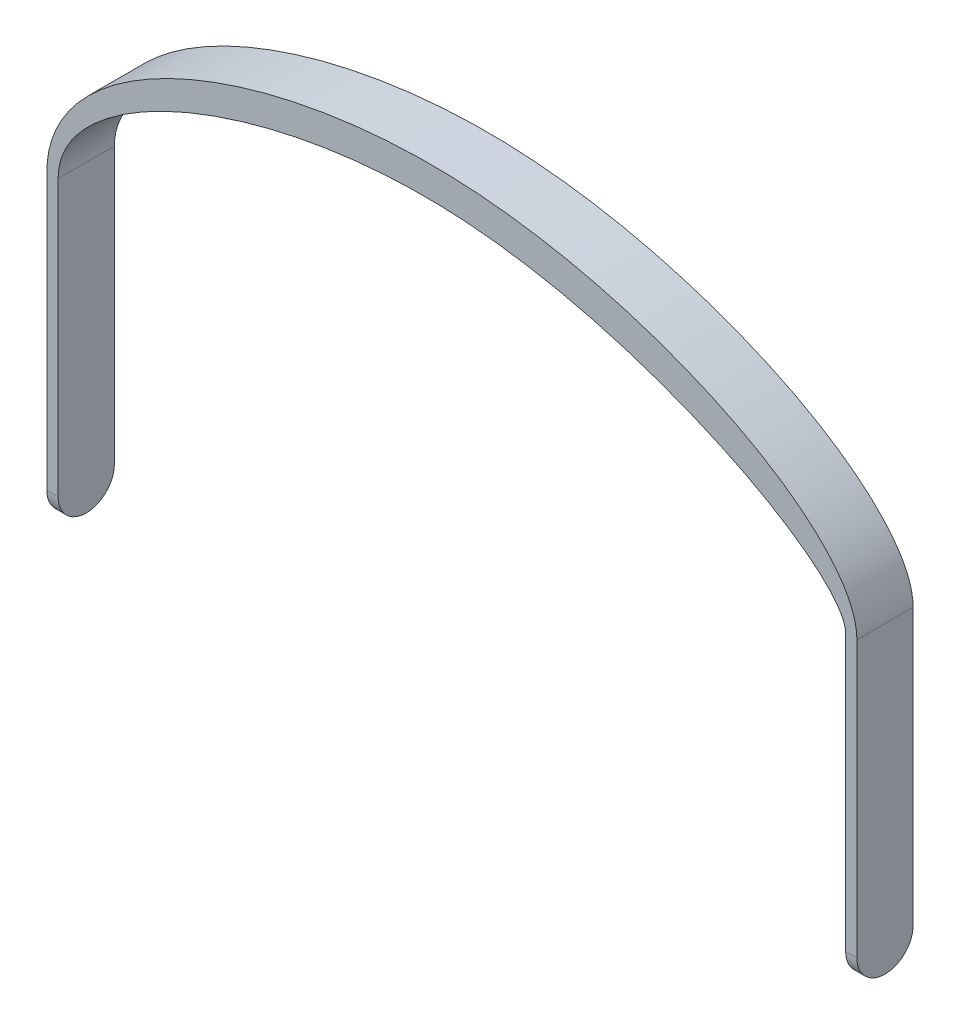
ISO-10303-21;
HEADER;
FILE_DESCRIPTION(('STEP AP214'),'2;1');
FILE_NAME('part.step','',(''),(''),'','','');
FILE_SCHEMA(('AUTOMOTIVE_DESIGN { 1 0 10303 214 1 1 1 1 }'));
ENDSEC;
DATA;
#1=APPLICATION_CONTEXT('core data for automotive mechanical design processes');
#2=APPLICATION_PROTOCOL_DEFINITION('international standard','automotive_design',2000,#1);
#3=PRODUCT_CONTEXT('',#1,'mechanical');
#4=PRODUCT('Part','Part','',(#3));
#5=PRODUCT_RELATED_PRODUCT_CATEGORY('part','',(#4));
#6=PRODUCT_DEFINITION_FORMATION('','',#4);
#7=PRODUCT_DEFINITION_CONTEXT('part definition',#1,'design');
#8=PRODUCT_DEFINITION('design','',#6,#7);
#9=PRODUCT_DEFINITION_SHAPE('','',#8);
#10=(LENGTH_UNIT() NAMED_UNIT(*) SI_UNIT(.MILLI.,.METRE.));
#11=(NAMED_UNIT(*) PLANE_ANGLE_UNIT() SI_UNIT($,.RADIAN.));
#12=(NAMED_UNIT(*) SI_UNIT($,.STERADIAN.) SOLID_ANGLE_UNIT());
#13=UNCERTAINTY_MEASURE_WITH_UNIT(LENGTH_MEASURE(1.E-05),#10,'distance_accuracy_value','');
#14=(GEOMETRIC_REPRESENTATION_CONTEXT(3) GLOBAL_UNCERTAINTY_ASSIGNED_CONTEXT((#13)) GLOBAL_UNIT_ASSIGNED_CONTEXT((#10,
#11,#12)) REPRESENTATION_CONTEXT('',''));
#15=CARTESIAN_POINT('',(0.,0.,0.));
#16=DIRECTION('',(0.,0.,1.));
#17=DIRECTION('',(1.,0.,0.));
#18=AXIS2_PLACEMENT_3D('',#15,#16,#17);
#19=CARTESIAN_POINT('',(182.88,-129.54,25.4));
#20=DIRECTION('',(-1.,0.,0.));
#21=DIRECTION('',(0.,0.,1.));
#22=AXIS2_PLACEMENT_3D('',#19,#20,#21);
#23=PLANE('',#22);
#24=CARTESIAN_POINT('',(182.88,-116.84,12.7));
#25=DIRECTION('',(-1.,0.,0.));
#26=DIRECTION('',(0.,0.,1.));
#27=AXIS2_PLACEMENT_3D('',#24,#25,#26);
#28=CIRCLE('',#27,12.7);
#29=CARTESIAN_POINT('',(182.88,-116.84,25.4));
#30=VERTEX_POINT('',#29);
#31=CARTESIAN_POINT('',(182.88,-129.54,12.7));
#32=VERTEX_POINT('',#31);
#33=EDGE_CURVE('E206',#30,#32,#28,.F.);
#34=ORIENTED_EDGE('',*,*,#33,.T.);
#35=CARTESIAN_POINT('',(182.88,-116.84,12.7));
#36=DIRECTION('',(-1.,0.,0.));
#37=DIRECTION('',(0.,0.,1.));
#38=AXIS2_PLACEMENT_3D('',#35,#36,#37);
#39=CIRCLE('',#38,12.7);
#40=CARTESIAN_POINT('',(182.88,-116.84,0.));
#41=VERTEX_POINT('',#40);
#42=EDGE_CURVE('E175',#32,#41,#39,.F.);
#43=ORIENTED_EDGE('',*,*,#42,.T.);
#44=DIRECTION('',(0.,1.,0.));
#45=VECTOR('',#44,1.);
#46=CARTESIAN_POINT('',(182.88,-129.54,0.));
#47=LINE('',#46,#45);
#48=CARTESIAN_POINT('',(182.88,7.57860607966033,0.));
#49=VERTEX_POINT('',#48);
#50=EDGE_CURVE('E122',#41,#49,#47,.T.);
#51=ORIENTED_EDGE('',*,*,#50,.T.);
#52=DIRECTION('',(0.,0.,-1.));
#53=VECTOR('',#52,1.);
#54=CARTESIAN_POINT('',(182.88,7.57860607966033,25.4));
#55=LINE('',#54,#53);
#56=CARTESIAN_POINT('',(182.88,7.57860607966033,25.4));
#57=VERTEX_POINT('',#56);
#58=EDGE_CURVE('E120',#57,#49,#55,.T.);
#59=ORIENTED_EDGE('',*,*,#58,.F.);
#60=DIRECTION('',(0.,1.,0.));
#61=VECTOR('',#60,1.);
#62=CARTESIAN_POINT('',(182.88,-129.54,25.4));
#63=LINE('',#62,#61);
#64=EDGE_CURVE('E107',#30,#57,#63,.T.);
#65=ORIENTED_EDGE('',*,*,#64,.F.);
#66=EDGE_LOOP('',(#34,#43,#51,#59,#65));
#67=FACE_BOUND('',#66,.T.);
#68=ADVANCED_FACE('F32',(#67),#23,.F.);
#69=CARTESIAN_POINT('',(182.88,7.57860607966033,25.4));
#70=CARTESIAN_POINT('',(182.88,46.7638219621217,25.4));
#71=CARTESIAN_POINT('',(-5.51913115903746E-13,141.3944737078,25.4));
#72=CARTESIAN_POINT('',(-182.88,58.9080605602155,25.4));
#73=CARTESIAN_POINT('',(-182.88,7.57860607966011,25.4));
#74=B_SPLINE_CURVE_WITH_KNOTS('',3,(#69,#70,#71,#72,#73),.UNSPECIFIED.,.F.,.F.,(4,1,4),(0.,
0.499999999999999,1.),.UNSPECIFIED.);
#75=DIRECTION('',(0.,0.,-1.));
#76=VECTOR('',#75,1.);
#77=SURFACE_OF_LINEAR_EXTRUSION('',#74,#76);
#78=CARTESIAN_POINT('',(182.88,7.57860607966033,0.));
#79=CARTESIAN_POINT('',(182.88,46.7638219621217,0.));
#80=CARTESIAN_POINT('',(-5.51913115903746E-13,141.3944737078,0.));
#81=CARTESIAN_POINT('',(-182.88,58.9080605602155,0.));
#82=CARTESIAN_POINT('',(-182.88,7.57860607966011,0.));
#83=B_SPLINE_CURVE_WITH_KNOTS('',3,(#78,#79,#80,#81,#82),.UNSPECIFIED.,.F.,.F.,(4,1,4),(0.,
0.499999999999999,1.),.UNSPECIFIED.);
#84=CARTESIAN_POINT('',(-182.88,7.57860607966011,0.));
#85=VERTEX_POINT('',#84);
#86=EDGE_CURVE('E214',#49,#85,#83,.T.);
#87=ORIENTED_EDGE('',*,*,#86,.T.);
#88=DIRECTION('',(0.,0.,-1.));
#89=VECTOR('',#88,1.);
#90=CARTESIAN_POINT('',(-182.88,7.57860607966011,25.4));
#91=LINE('',#90,#89);
#92=CARTESIAN_POINT('',(-182.88,7.57860607966011,25.4));
#93=VERTEX_POINT('',#92);
#94=EDGE_CURVE('E127',#93,#85,#91,.T.);
#95=ORIENTED_EDGE('',*,*,#94,.F.);
#96=EDGE_CURVE('E112',#57,#93,#74,.T.);
#97=ORIENTED_EDGE('',*,*,#96,.F.);
#98=ORIENTED_EDGE('',*,*,#58,.T.);
#99=EDGE_LOOP('',(#87,#95,#97,#98));
#100=FACE_BOUND('',#99,.T.);
#101=ADVANCED_FACE('F129',(#100),#77,.F.);
#102=CARTESIAN_POINT('',(-182.88,-129.54,25.4));
#103=DIRECTION('',(-1.,0.,0.));
#104=DIRECTION('',(0.,-1.,0.));
#105=AXIS2_PLACEMENT_3D('',#102,#103,#104);
#106=PLANE('',#105);
#107=DIRECTION('',(0.,1.,0.));
#108=VECTOR('',#107,1.);
#109=CARTESIAN_POINT('',(-182.88,-129.54,0.));
#110=LINE('',#109,#108);
#111=CARTESIAN_POINT('',(-182.88,-116.84,0.));
#112=VERTEX_POINT('',#111);
#113=EDGE_CURVE('E216',#112,#85,#110,.T.);
#114=ORIENTED_EDGE('',*,*,#113,.F.);
#115=CARTESIAN_POINT('',(-182.88,-116.84,12.7));
#116=DIRECTION('',(-1.,0.,0.));
#117=DIRECTION('',(0.,-1.,0.));
#118=AXIS2_PLACEMENT_3D('',#115,#116,#117);
#119=CIRCLE('',#118,12.7);
#120=CARTESIAN_POINT('',(-182.88,-129.54,12.7));
#121=VERTEX_POINT('',#120);
#122=EDGE_CURVE('E198',#112,#121,#119,.T.);
#123=ORIENTED_EDGE('',*,*,#122,.T.);
#124=CARTESIAN_POINT('',(-182.88,-116.84,12.7));
#125=DIRECTION('',(-1.,0.,0.));
#126=DIRECTION('',(0.,-1.,0.));
#127=AXIS2_PLACEMENT_3D('',#124,#125,#126);
#128=CIRCLE('',#127,12.7);
#129=CARTESIAN_POINT('',(-182.88,-116.84,25.4));
#130=VERTEX_POINT('',#129);
#131=EDGE_CURVE('E196',#121,#130,#128,.T.);
#132=ORIENTED_EDGE('',*,*,#131,.T.);
#133=DIRECTION('',(0.,1.,0.));
#134=VECTOR('',#133,1.);
#135=CARTESIAN_POINT('',(-182.88,-129.54,25.4));
#136=LINE('',#135,#134);
#137=EDGE_CURVE('E131',#130,#93,#136,.T.);
#138=ORIENTED_EDGE('',*,*,#137,.T.);
#139=ORIENTED_EDGE('',*,*,#94,.T.);
#140=EDGE_LOOP('',(#114,#123,#132,#138,#139));
#141=FACE_BOUND('',#140,.T.);
#142=ADVANCED_FACE('F146',(#141),#106,.T.);
#143=CARTESIAN_POINT('',(-177.8,7.57860607966027,25.4));
#144=DIRECTION('',(1.,0.,0.));
#145=DIRECTION('',(0.,0.,-1.));
#146=AXIS2_PLACEMENT_3D('',#143,#144,#145);
#147=PLANE('',#146);
#148=CARTESIAN_POINT('',(-177.8,-116.84,12.7));
#149=DIRECTION('',(1.,0.,0.));
#150=DIRECTION('',(0.,0.,-1.));
#151=AXIS2_PLACEMENT_3D('',#148,#149,#150);
#152=CIRCLE('',#151,12.7);
#153=CARTESIAN_POINT('',(-177.8,-116.84,25.4));
#154=VERTEX_POINT('',#153);
#155=CARTESIAN_POINT('',(-177.8,-129.54,12.7));
#156=VERTEX_POINT('',#155);
#157=EDGE_CURVE('E200',#154,#156,#152,.T.);
#158=ORIENTED_EDGE('',*,*,#157,.T.);
#159=CARTESIAN_POINT('',(-177.8,-116.84,12.7));
#160=DIRECTION('',(1.,0.,0.));
#161=DIRECTION('',(0.,0.,-1.));
#162=AXIS2_PLACEMENT_3D('',#159,#160,#161);
#163=CIRCLE('',#162,12.7);
#164=CARTESIAN_POINT('',(-177.8,-116.84,0.));
#165=VERTEX_POINT('',#164);
#166=EDGE_CURVE('E202',#156,#165,#163,.T.);
#167=ORIENTED_EDGE('',*,*,#166,.T.);
#168=DIRECTION('',(0.,-1.,0.));
#169=VECTOR('',#168,1.);
#170=CARTESIAN_POINT('',(-177.8,7.57860607966027,0.));
#171=LINE('',#170,#169);
#172=CARTESIAN_POINT('',(-177.8,7.57860607966027,0.));
#173=VERTEX_POINT('',#172);
#174=EDGE_CURVE('E183',#173,#165,#171,.T.);
#175=ORIENTED_EDGE('',*,*,#174,.F.);
#176=DIRECTION('',(0.,0.,-1.));
#177=VECTOR('',#176,1.);
#178=CARTESIAN_POINT('',(-177.8,7.57860607966027,25.4));
#179=LINE('',#178,#177);
#180=CARTESIAN_POINT('',(-177.8,7.57860607966027,25.4));
#181=VERTEX_POINT('',#180);
#182=EDGE_CURVE('E190',#181,#173,#179,.T.);
#183=ORIENTED_EDGE('',*,*,#182,.F.);
#184=DIRECTION('',(0.,-1.,0.));
#185=VECTOR('',#184,1.);
#186=CARTESIAN_POINT('',(-177.8,7.57860607966027,25.4));
#187=LINE('',#186,#185);
#188=EDGE_CURVE('E133',#181,#154,#187,.T.);
#189=ORIENTED_EDGE('',*,*,#188,.T.);
#190=EDGE_LOOP('',(#158,#167,#175,#183,#189));
#191=FACE_BOUND('',#190,.T.);
#192=ADVANCED_FACE('F237',(#191),#147,.T.);
#193=CARTESIAN_POINT('',(-177.8,7.57860607966027,25.4));
#194=CARTESIAN_POINT('',(-177.8,46.3000782283205,25.4));
#195=CARTESIAN_POINT('',(1.48644117847763E-12,128.042210107522,25.4));
#196=CARTESIAN_POINT('',(177.8,30.0171278246351,25.4));
#197=CARTESIAN_POINT('',(177.8,7.57860607966014,25.4));
#198=B_SPLINE_CURVE_WITH_KNOTS('',3,(#193,#194,#195,#196,#197),.UNSPECIFIED.,.F.,.F.,(4,1,4),
(0.,0.499999999999998,1.),.UNSPECIFIED.);
#199=DIRECTION('',(0.,0.,-1.));
#200=VECTOR('',#199,1.);
#201=SURFACE_OF_LINEAR_EXTRUSION('',#198,#200);
#202=CARTESIAN_POINT('',(-177.8,7.57860607966027,0.));
#203=CARTESIAN_POINT('',(-177.8,46.3000782283205,0.));
#204=CARTESIAN_POINT('',(1.48644117847763E-12,128.042210107522,0.));
#205=CARTESIAN_POINT('',(177.8,30.0171278246351,0.));
#206=CARTESIAN_POINT('',(177.8,7.57860607966014,0.));
#207=B_SPLINE_CURVE_WITH_KNOTS('',3,(#202,#203,#204,#205,#206),.UNSPECIFIED.,.F.,.F.,(4,1,4),
(0.,0.499999999999998,1.),.UNSPECIFIED.);
#208=CARTESIAN_POINT('',(177.8,7.57860607966014,0.));
#209=VERTEX_POINT('',#208);
#210=EDGE_CURVE('E181',#173,#209,#207,.T.);
#211=ORIENTED_EDGE('',*,*,#210,.T.);
#212=DIRECTION('',(0.,0.,-1.));
#213=VECTOR('',#212,1.);
#214=CARTESIAN_POINT('',(177.8,7.57860607966014,25.4));
#215=LINE('',#214,#213);
#216=CARTESIAN_POINT('',(177.8,7.57860607966014,25.4));
#217=VERTEX_POINT('',#216);
#218=EDGE_CURVE('E180',#217,#209,#215,.T.);
#219=ORIENTED_EDGE('',*,*,#218,.F.);
#220=EDGE_CURVE('E239',#181,#217,#198,.T.);
#221=ORIENTED_EDGE('',*,*,#220,.F.);
#222=ORIENTED_EDGE('',*,*,#182,.T.);
#223=EDGE_LOOP('',(#211,#219,#221,#222));
#224=FACE_BOUND('',#223,.T.);
#225=ADVANCED_FACE('F247',(#224),#201,.F.);
#226=CARTESIAN_POINT('',(177.8,7.57860607966027,25.4));
#227=DIRECTION('',(1.,0.,0.));
#228=DIRECTION('',(0.,0.,-1.));
#229=AXIS2_PLACEMENT_3D('',#226,#227,#228);
#230=PLANE('',#229);
#231=DIRECTION('',(0.,-1.,0.));
#232=VECTOR('',#231,1.);
#233=CARTESIAN_POINT('',(177.8,7.57860607966027,0.));
#234=LINE('',#233,#232);
#235=CARTESIAN_POINT('',(177.8,-116.84,0.));
#236=VERTEX_POINT('',#235);
#237=EDGE_CURVE('E117',#209,#236,#234,.T.);
#238=ORIENTED_EDGE('',*,*,#237,.T.);
#239=CARTESIAN_POINT('',(177.8,-116.84,12.7));
#240=DIRECTION('',(1.,0.,0.));
#241=DIRECTION('',(0.,0.,-1.));
#242=AXIS2_PLACEMENT_3D('',#239,#240,#241);
#243=CIRCLE('',#242,12.7);
#244=CARTESIAN_POINT('',(177.8,-129.54,12.7));
#245=VERTEX_POINT('',#244);
#246=EDGE_CURVE('E41',#236,#245,#243,.F.);
#247=ORIENTED_EDGE('',*,*,#246,.T.);
#248=CARTESIAN_POINT('',(177.8,-116.84,12.7));
#249=DIRECTION('',(1.,0.,0.));
#250=DIRECTION('',(0.,0.,-1.));
#251=AXIS2_PLACEMENT_3D('',#248,#249,#250);
#252=CIRCLE('',#251,12.7);
#253=CARTESIAN_POINT('',(177.8,-116.84,25.4));
#254=VERTEX_POINT('',#253);
#255=EDGE_CURVE('E48',#245,#254,#252,.F.);
#256=ORIENTED_EDGE('',*,*,#255,.T.);
#257=DIRECTION('',(0.,-1.,0.));
#258=VECTOR('',#257,1.);
#259=CARTESIAN_POINT('',(177.8,7.57860607966027,25.4));
#260=LINE('',#259,#258);
#261=EDGE_CURVE('E191',#217,#254,#260,.T.);
#262=ORIENTED_EDGE('',*,*,#261,.F.);
#263=ORIENTED_EDGE('',*,*,#218,.T.);
#264=EDGE_LOOP('',(#238,#247,#256,#262,#263));
#265=FACE_BOUND('',#264,.T.);
#266=ADVANCED_FACE('F178',(#265),#230,.F.);
#267=CARTESIAN_POINT('',(-5.01922947648836E-13,97.1152074844843,25.4));
#268=DIRECTION('',(0.,0.,-1.));
#269=DIRECTION('',(-1.,0.,0.));
#270=AXIS2_PLACEMENT_3D('',#267,#268,#269);
#271=PLANE('',#270);
#272=ORIENTED_EDGE('',*,*,#261,.T.);
#273=DIRECTION('',(1.,0.,0.));
#274=VECTOR('',#273,1.);
#275=CARTESIAN_POINT('',(-5.01922947648836E-13,-116.84,25.4));
#276=LINE('',#275,#274);
#277=EDGE_CURVE('E11',#254,#30,#276,.T.);
#278=ORIENTED_EDGE('',*,*,#277,.T.);
#279=ORIENTED_EDGE('',*,*,#64,.T.);
#280=ORIENTED_EDGE('',*,*,#96,.T.);
#281=ORIENTED_EDGE('',*,*,#137,.F.);
#282=DIRECTION('',(-1.,0.,0.));
#283=VECTOR('',#282,1.);
#284=CARTESIAN_POINT('',(-177.8,-116.84,25.4));
#285=LINE('',#284,#283);
#286=EDGE_CURVE('E204',#130,#154,#285,.F.);
#287=ORIENTED_EDGE('',*,*,#286,.T.);
#288=ORIENTED_EDGE('',*,*,#188,.F.);
#289=ORIENTED_EDGE('',*,*,#220,.T.);
#290=EDGE_LOOP('',(#272,#278,#279,#280,#281,#287,#288,#289));
#291=FACE_BOUND('',#290,.T.);
#292=ADVANCED_FACE('F109',(#291),#271,.F.);
#293=CARTESIAN_POINT('',(-5.01922947648836E-13,97.1152074844843,0.));
#294=DIRECTION('',(0.,0.,-1.));
#295=DIRECTION('',(-1.,0.,0.));
#296=AXIS2_PLACEMENT_3D('',#293,#294,#295);
#297=PLANE('',#296);
#298=ORIENTED_EDGE('',*,*,#50,.F.);
#299=DIRECTION('',(1.,0.,0.));
#300=VECTOR('',#299,1.);
#301=CARTESIAN_POINT('',(177.8,-116.84,0.));
#302=LINE('',#301,#300);
#303=EDGE_CURVE('E169',#41,#236,#302,.F.);
#304=ORIENTED_EDGE('',*,*,#303,.T.);
#305=ORIENTED_EDGE('',*,*,#237,.F.);
#306=ORIENTED_EDGE('',*,*,#210,.F.);
#307=ORIENTED_EDGE('',*,*,#174,.T.);
#308=DIRECTION('',(-1.,0.,0.));
#309=VECTOR('',#308,1.);
#310=CARTESIAN_POINT('',(-5.01922947648836E-13,-116.84,0.));
#311=LINE('',#310,#309);
#312=EDGE_CURVE('E126',#165,#112,#311,.T.);
#313=ORIENTED_EDGE('',*,*,#312,.T.);
#314=ORIENTED_EDGE('',*,*,#113,.T.);
#315=ORIENTED_EDGE('',*,*,#86,.F.);
#316=EDGE_LOOP('',(#298,#304,#305,#306,#307,#313,#314,#315));
#317=FACE_BOUND('',#316,.T.);
#318=ADVANCED_FACE('F156',(#317),#297,.T.);
#319=CARTESIAN_POINT('',(-177.8,-116.84,12.7));
#320=DIRECTION('',(1.,0.,0.));
#321=DIRECTION('',(0.,0.,-1.));
#322=AXIS2_PLACEMENT_3D('',#319,#320,#321);
#323=CYLINDRICAL_SURFACE('',#322,12.7);
#324=DIRECTION('',(-1.,0.,0.));
#325=VECTOR('',#324,1.);
#326=CARTESIAN_POINT('',(-182.88,-129.54,12.7));
#327=LINE('',#326,#325);
#328=EDGE_CURVE('E207',#156,#121,#327,.T.);
#329=ORIENTED_EDGE('',*,*,#328,.F.);
#330=ORIENTED_EDGE('',*,*,#157,.F.);
#331=ORIENTED_EDGE('',*,*,#286,.F.);
#332=ORIENTED_EDGE('',*,*,#131,.F.);
#333=EDGE_LOOP('',(#329,#330,#331,#332));
#334=FACE_BOUND('',#333,.T.);
#335=ADVANCED_FACE('F153',(#334),#323,.T.);
#336=CARTESIAN_POINT('',(-5.01922947648836E-13,-116.84,12.7));
#337=DIRECTION('',(-1.,0.,0.));
#338=DIRECTION('',(0.,0.,1.));
#339=AXIS2_PLACEMENT_3D('',#336,#337,#338);
#340=CYLINDRICAL_SURFACE('',#339,12.7);
#341=ORIENTED_EDGE('',*,*,#166,.F.);
#342=ORIENTED_EDGE('',*,*,#328,.T.);
#343=ORIENTED_EDGE('',*,*,#122,.F.);
#344=ORIENTED_EDGE('',*,*,#312,.F.);
#345=EDGE_LOOP('',(#341,#342,#343,#344));
#346=FACE_BOUND('',#345,.T.);
#347=ADVANCED_FACE('F150',(#346),#340,.T.);
#348=CARTESIAN_POINT('',(-5.01922947648836E-13,-116.84,12.7));
#349=DIRECTION('',(1.,0.,0.));
#350=DIRECTION('',(0.,0.,-1.));
#351=AXIS2_PLACEMENT_3D('',#348,#349,#350);
#352=CYLINDRICAL_SURFACE('',#351,12.7);
#353=ORIENTED_EDGE('',*,*,#277,.F.);
#354=ORIENTED_EDGE('',*,*,#255,.F.);
#355=DIRECTION('',(1.,0.,0.));
#356=VECTOR('',#355,1.);
#357=CARTESIAN_POINT('',(177.8,-129.54,12.7));
#358=LINE('',#357,#356);
#359=EDGE_CURVE('E36',#32,#245,#358,.F.);
#360=ORIENTED_EDGE('',*,*,#359,.F.);
#361=ORIENTED_EDGE('',*,*,#33,.F.);
#362=EDGE_LOOP('',(#353,#354,#360,#361));
#363=FACE_BOUND('',#362,.T.);
#364=ADVANCED_FACE('F34',(#363),#352,.T.);
#365=CARTESIAN_POINT('',(177.8,-116.84,12.7));
#366=DIRECTION('',(-1.,0.,0.));
#367=DIRECTION('',(0.,0.,1.));
#368=AXIS2_PLACEMENT_3D('',#365,#366,#367);
#369=CYLINDRICAL_SURFACE('',#368,12.7);
#370=ORIENTED_EDGE('',*,*,#246,.F.);
#371=ORIENTED_EDGE('',*,*,#303,.F.);
#372=ORIENTED_EDGE('',*,*,#42,.F.);
#373=ORIENTED_EDGE('',*,*,#359,.T.);
#374=EDGE_LOOP('',(#370,#371,#372,#373));
#375=FACE_BOUND('',#374,.T.);
#376=ADVANCED_FACE('F158',(#375),#369,.T.);
#377=CLOSED_SHELL('',(#68,#101,#142,#192,#225,#266,#292,#318,#335,#347,#364,#376));
#378=MANIFOLD_SOLID_BREP('B2',#377);
#379=ADVANCED_BREP_SHAPE_REPRESENTATION('',(#18,#378),#14);
#380=SHAPE_DEFINITION_REPRESENTATION(#9,#379);
ENDSEC;
END-ISO-10303-21;
